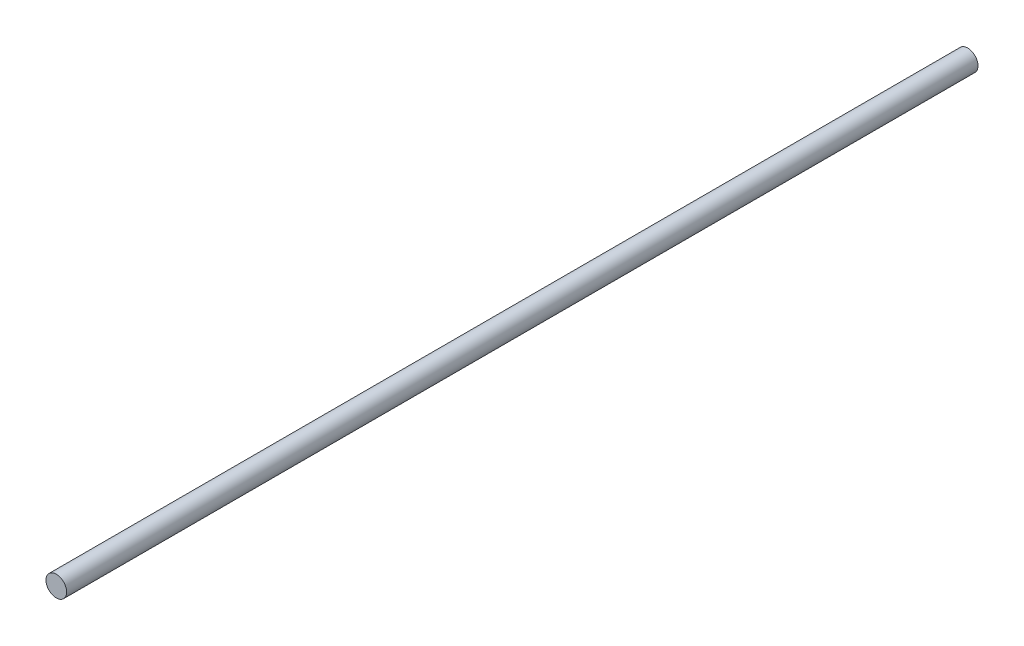
ISO-10303-21;
HEADER;
FILE_DESCRIPTION(('STEP AP214'),'2;1');
FILE_NAME('part.step','',(''),(''),'','','');
FILE_SCHEMA(('AUTOMOTIVE_DESIGN { 1 0 10303 214 1 1 1 1 }'));
ENDSEC;
DATA;
#1=APPLICATION_CONTEXT('core data for automotive mechanical design processes');
#2=APPLICATION_PROTOCOL_DEFINITION('international standard','automotive_design',2000,#1);
#3=PRODUCT_CONTEXT('',#1,'mechanical');
#4=PRODUCT('Part','Part','',(#3));
#5=PRODUCT_RELATED_PRODUCT_CATEGORY('part','',(#4));
#6=PRODUCT_DEFINITION_FORMATION('','',#4);
#7=PRODUCT_DEFINITION_CONTEXT('part definition',#1,'design');
#8=PRODUCT_DEFINITION('design','',#6,#7);
#9=PRODUCT_DEFINITION_SHAPE('','',#8);
#10=(LENGTH_UNIT() NAMED_UNIT(*) SI_UNIT(.MILLI.,.METRE.));
#11=(NAMED_UNIT(*) PLANE_ANGLE_UNIT() SI_UNIT($,.RADIAN.));
#12=(NAMED_UNIT(*) SI_UNIT($,.STERADIAN.) SOLID_ANGLE_UNIT());
#13=UNCERTAINTY_MEASURE_WITH_UNIT(LENGTH_MEASURE(1.E-05),#10,'distance_accuracy_value','');
#14=(GEOMETRIC_REPRESENTATION_CONTEXT(3) GLOBAL_UNCERTAINTY_ASSIGNED_CONTEXT((#13)) GLOBAL_UNIT_ASSIGNED_CONTEXT((#10,
#11,#12)) REPRESENTATION_CONTEXT('',''));
#15=CARTESIAN_POINT('',(0.,0.,0.));
#16=DIRECTION('',(0.,0.,1.));
#17=DIRECTION('',(1.,0.,0.));
#18=AXIS2_PLACEMENT_3D('',#15,#16,#17);
#19=CARTESIAN_POINT('',(0.,0.,265.));
#20=DIRECTION('',(0.,0.,-1.));
#21=DIRECTION('',(-1.,0.,0.));
#22=AXIS2_PLACEMENT_3D('',#19,#20,#21);
#23=CYLINDRICAL_SURFACE('',#22,3.);
#24=CARTESIAN_POINT('',(0.,0.,265.));
#25=DIRECTION('',(0.,0.,1.));
#26=DIRECTION('',(1.,0.,0.));
#27=AXIS2_PLACEMENT_3D('',#24,#25,#26);
#28=CIRCLE('',#27,3.);
#29=CARTESIAN_POINT('',(3.,0.,265.));
#30=VERTEX_POINT('',#29);
#31=EDGE_CURVE('E10',#30,#30,#28,.T.);
#32=ORIENTED_EDGE('',*,*,#31,.F.);
#33=EDGE_LOOP('',(#32));
#34=FACE_BOUND('',#33,.T.);
#35=CARTESIAN_POINT('',(0.,0.,0.));
#36=DIRECTION('',(0.,0.,1.));
#37=DIRECTION('',(1.,0.,0.));
#38=AXIS2_PLACEMENT_3D('',#35,#36,#37);
#39=CIRCLE('',#38,3.);
#40=CARTESIAN_POINT('',(3.,0.,0.));
#41=VERTEX_POINT('',#40);
#42=EDGE_CURVE('E35',#41,#41,#39,.T.);
#43=ORIENTED_EDGE('',*,*,#42,.T.);
#44=EDGE_LOOP('',(#43));
#45=FACE_BOUND('',#44,.T.);
#46=ADVANCED_FACE('F32',(#34,#45),#23,.T.);
#47=CARTESIAN_POINT('',(0.,0.,265.));
#48=DIRECTION('',(0.,0.,1.));
#49=DIRECTION('',(1.,0.,0.));
#50=AXIS2_PLACEMENT_3D('',#47,#48,#49);
#51=PLANE('',#50);
#52=ORIENTED_EDGE('',*,*,#31,.T.);
#53=EDGE_LOOP('',(#52));
#54=FACE_BOUND('',#53,.T.);
#55=ADVANCED_FACE('F47',(#54),#51,.T.);
#56=CARTESIAN_POINT('',(0.,0.,0.));
#57=DIRECTION('',(0.,0.,1.));
#58=DIRECTION('',(1.,0.,0.));
#59=AXIS2_PLACEMENT_3D('',#56,#57,#58);
#60=PLANE('',#59);
#61=ORIENTED_EDGE('',*,*,#42,.F.);
#62=EDGE_LOOP('',(#61));
#63=FACE_BOUND('',#62,.T.);
#64=ADVANCED_FACE('F45',(#63),#60,.F.);
#65=CLOSED_SHELL('',(#46,#55,#64));
#66=MANIFOLD_SOLID_BREP('B2',#65);
#67=ADVANCED_BREP_SHAPE_REPRESENTATION('',(#18,#66),#14);
#68=SHAPE_DEFINITION_REPRESENTATION(#9,#67);
ENDSEC;
END-ISO-10303-21;
